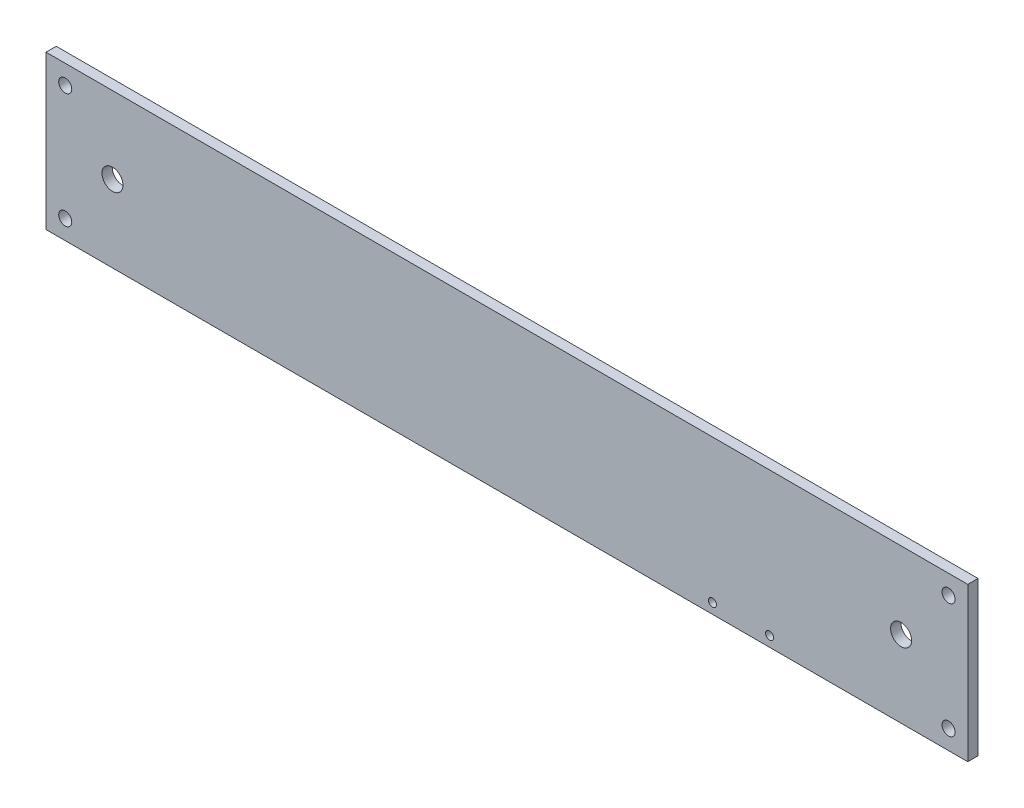
ISO-10303-21;
HEADER;
FILE_DESCRIPTION(('STEP AP214'),'2;1');
FILE_NAME('part.step','',(''),(''),'','','');
FILE_SCHEMA(('AUTOMOTIVE_DESIGN { 1 0 10303 214 1 1 1 1 }'));
ENDSEC;
DATA;
#1=APPLICATION_CONTEXT('core data for automotive mechanical design processes');
#2=APPLICATION_PROTOCOL_DEFINITION('international standard','automotive_design',2000,#1);
#3=PRODUCT_CONTEXT('',#1,'mechanical');
#4=PRODUCT('Part','Part','',(#3));
#5=PRODUCT_RELATED_PRODUCT_CATEGORY('part','',(#4));
#6=PRODUCT_DEFINITION_FORMATION('','',#4);
#7=PRODUCT_DEFINITION_CONTEXT('part definition',#1,'design');
#8=PRODUCT_DEFINITION('design','',#6,#7);
#9=PRODUCT_DEFINITION_SHAPE('','',#8);
#10=(LENGTH_UNIT() NAMED_UNIT(*) SI_UNIT(.MILLI.,.METRE.));
#11=(NAMED_UNIT(*) PLANE_ANGLE_UNIT() SI_UNIT($,.RADIAN.));
#12=(NAMED_UNIT(*) SI_UNIT($,.STERADIAN.) SOLID_ANGLE_UNIT());
#13=UNCERTAINTY_MEASURE_WITH_UNIT(LENGTH_MEASURE(1.E-05),#10,'distance_accuracy_value','');
#14=(GEOMETRIC_REPRESENTATION_CONTEXT(3) GLOBAL_UNCERTAINTY_ASSIGNED_CONTEXT((#13)) GLOBAL_UNIT_ASSIGNED_CONTEXT((#10,
#11,#12)) REPRESENTATION_CONTEXT('',''));
#15=CARTESIAN_POINT('',(0.,0.,0.));
#16=DIRECTION('',(0.,0.,1.));
#17=DIRECTION('',(1.,0.,0.));
#18=AXIS2_PLACEMENT_3D('',#15,#16,#17);
#19=CARTESIAN_POINT('',(0.,0.,4.));
#20=DIRECTION('',(0.,0.,1.));
#21=DIRECTION('',(1.,0.,0.));
#22=AXIS2_PLACEMENT_3D('',#19,#20,#21);
#23=PLANE('',#22);
#24=CARTESIAN_POINT('',(256.65,-25.9999999999998,4.));
#25=DIRECTION('',(0.,0.,1.));
#26=DIRECTION('',(1.,0.,0.));
#27=AXIS2_PLACEMENT_3D('',#24,#25,#26);
#28=CIRCLE('',#27,1.54999999999999);
#29=CARTESIAN_POINT('',(258.2,-25.9999999999998,4.));
#30=VERTEX_POINT('',#29);
#31=EDGE_CURVE('E153',#30,#30,#28,.T.);
#32=ORIENTED_EDGE('',*,*,#31,.F.);
#33=EDGE_LOOP('',(#32));
#34=FACE_BOUND('',#33,.T.);
#35=CARTESIAN_POINT('',(234.35,-25.9999999999998,4.));
#36=DIRECTION('',(0.,0.,1.));
#37=DIRECTION('',(1.,0.,0.));
#38=AXIS2_PLACEMENT_3D('',#35,#36,#37);
#39=CIRCLE('',#38,1.54999999999999);
#40=CARTESIAN_POINT('',(235.9,-25.9999999999998,4.));
#41=VERTEX_POINT('',#40);
#42=EDGE_CURVE('E147',#41,#41,#39,.T.);
#43=ORIENTED_EDGE('',*,*,#42,.F.);
#44=EDGE_LOOP('',(#43));
#45=FACE_BOUND('',#44,.T.);
#46=CARTESIAN_POINT('',(326.533928070041,22.4926529763048,4.));
#47=DIRECTION('',(0.,0.,1.));
#48=DIRECTION('',(1.,0.,0.));
#49=AXIS2_PLACEMENT_3D('',#46,#47,#48);
#50=CIRCLE('',#49,2.55000000000075);
#51=CARTESIAN_POINT('',(329.083928070042,22.4926529763048,4.));
#52=VERTEX_POINT('',#51);
#53=EDGE_CURVE('E132',#52,#52,#50,.T.);
#54=ORIENTED_EDGE('',*,*,#53,.F.);
#55=EDGE_LOOP('',(#54));
#56=FACE_BOUND('',#55,.T.);
#57=CARTESIAN_POINT('',(-18.4513778825719,22.4926529763051,4.));
#58=DIRECTION('',(0.,0.,1.));
#59=DIRECTION('',(1.,0.,0.));
#60=AXIS2_PLACEMENT_3D('',#57,#58,#59);
#61=CIRCLE('',#60,2.55000000000074);
#62=CARTESIAN_POINT('',(-15.9013778825712,22.4926529763051,4.));
#63=VERTEX_POINT('',#62);
#64=EDGE_CURVE('E120',#63,#63,#61,.T.);
#65=ORIENTED_EDGE('',*,*,#64,.F.);
#66=EDGE_LOOP('',(#65));
#67=FACE_BOUND('',#66,.T.);
#68=CARTESIAN_POINT('',(0.,0.,4.));
#69=DIRECTION('',(0.,0.,1.));
#70=DIRECTION('',(1.,0.,0.));
#71=AXIS2_PLACEMENT_3D('',#68,#69,#70);
#72=CIRCLE('',#71,4.09999999999994);
#73=CARTESIAN_POINT('',(4.10000000000002,0.,4.));
#74=VERTEX_POINT('',#73);
#75=EDGE_CURVE('E99',#74,#74,#72,.T.);
#76=ORIENTED_EDGE('',*,*,#75,.F.);
#77=EDGE_LOOP('',(#76));
#78=FACE_BOUND('',#77,.T.);
#79=DIRECTION('',(-1.,0.,0.));
#80=VECTOR('',#79,1.);
#81=CARTESIAN_POINT('',(334.041275093734,29.9999999999983,4.));
#82=LINE('',#81,#80);
#83=CARTESIAN_POINT('',(334.041275093734,29.9999999999983,4.));
#84=VERTEX_POINT('',#83);
#85=CARTESIAN_POINT('',(-25.9587249062654,29.9999999999983,4.));
#86=VERTEX_POINT('',#85);
#87=EDGE_CURVE('E84',#84,#86,#82,.T.);
#88=ORIENTED_EDGE('',*,*,#87,.T.);
#89=DIRECTION('',(0.,-1.,0.));
#90=VECTOR('',#89,1.);
#91=CARTESIAN_POINT('',(-25.9587249062654,29.9999999999983,4.));
#92=LINE('',#91,#90);
#93=CARTESIAN_POINT('',(-25.9587249062655,-30.0000000000017,4.));
#94=VERTEX_POINT('',#93);
#95=EDGE_CURVE('E79',#86,#94,#92,.T.);
#96=ORIENTED_EDGE('',*,*,#95,.T.);
#97=DIRECTION('',(1.,0.,0.));
#98=VECTOR('',#97,1.);
#99=CARTESIAN_POINT('',(-25.9587249062655,-30.0000000000017,4.));
#100=LINE('',#99,#98);
#101=CARTESIAN_POINT('',(334.041275093734,-30.0000000000017,4.));
#102=VERTEX_POINT('',#101);
#103=EDGE_CURVE('E82',#94,#102,#100,.T.);
#104=ORIENTED_EDGE('',*,*,#103,.T.);
#105=DIRECTION('',(0.,1.,0.));
#106=VECTOR('',#105,1.);
#107=CARTESIAN_POINT('',(334.041275093734,-30.0000000000017,4.));
#108=LINE('',#107,#106);
#109=EDGE_CURVE('E49',#102,#84,#108,.T.);
#110=ORIENTED_EDGE('',*,*,#109,.T.);
#111=EDGE_LOOP('',(#88,#96,#104,#110));
#112=FACE_BOUND('',#111,.T.);
#113=CARTESIAN_POINT('',(308.,1.87122327035823E-13,4.));
#114=DIRECTION('',(0.,0.,1.));
#115=DIRECTION('',(1.,0.,0.));
#116=AXIS2_PLACEMENT_3D('',#113,#114,#115);
#117=CIRCLE('',#116,4.09999999999999);
#118=CARTESIAN_POINT('',(312.1,1.87122327035823E-13,4.));
#119=VERTEX_POINT('',#118);
#120=EDGE_CURVE('E114',#119,#119,#117,.T.);
#121=ORIENTED_EDGE('',*,*,#120,.F.);
#122=EDGE_LOOP('',(#121));
#123=FACE_BOUND('',#122,.T.);
#124=CARTESIAN_POINT('',(-18.451377882572,-22.4926529763077,4.));
#125=DIRECTION('',(0.,0.,1.));
#126=DIRECTION('',(1.,0.,0.));
#127=AXIS2_PLACEMENT_3D('',#124,#125,#126);
#128=CIRCLE('',#127,2.55000000000077);
#129=CARTESIAN_POINT('',(-15.9013778825712,-22.4926529763077,4.));
#130=VERTEX_POINT('',#129);
#131=EDGE_CURVE('E126',#130,#130,#128,.T.);
#132=ORIENTED_EDGE('',*,*,#131,.F.);
#133=EDGE_LOOP('',(#132));
#134=FACE_BOUND('',#133,.T.);
#135=CARTESIAN_POINT('',(326.533928070041,-22.4926529763081,4.));
#136=DIRECTION('',(0.,0.,1.));
#137=DIRECTION('',(1.,0.,0.));
#138=AXIS2_PLACEMENT_3D('',#135,#136,#137);
#139=CIRCLE('',#138,2.55000000000075);
#140=CARTESIAN_POINT('',(329.083928070042,-22.4926529763081,4.));
#141=VERTEX_POINT('',#140);
#142=EDGE_CURVE('E138',#141,#141,#139,.T.);
#143=ORIENTED_EDGE('',*,*,#142,.F.);
#144=EDGE_LOOP('',(#143));
#145=FACE_BOUND('',#144,.T.);
#146=ADVANCED_FACE('F32',(#34,#45,#56,#67,#78,#112,#123,#134,#145),#23,.T.);
#147=CARTESIAN_POINT('',(0.,0.,0.));
#148=DIRECTION('',(0.,0.,1.));
#149=DIRECTION('',(1.,0.,0.));
#150=AXIS2_PLACEMENT_3D('',#147,#148,#149);
#151=PLANE('',#150);
#152=CARTESIAN_POINT('',(256.65,-25.9999999999998,0.));
#153=DIRECTION('',(0.,0.,1.));
#154=DIRECTION('',(1.,0.,0.));
#155=AXIS2_PLACEMENT_3D('',#152,#153,#154);
#156=CIRCLE('',#155,1.54999999999999);
#157=CARTESIAN_POINT('',(258.2,-25.9999999999998,0.));
#158=VERTEX_POINT('',#157);
#159=EDGE_CURVE('E144',#158,#158,#156,.T.);
#160=ORIENTED_EDGE('',*,*,#159,.T.);
#161=EDGE_LOOP('',(#160));
#162=FACE_BOUND('',#161,.T.);
#163=CARTESIAN_POINT('',(234.35,-25.9999999999998,0.));
#164=DIRECTION('',(0.,0.,1.));
#165=DIRECTION('',(1.,0.,0.));
#166=AXIS2_PLACEMENT_3D('',#163,#164,#165);
#167=CIRCLE('',#166,1.54999999999999);
#168=CARTESIAN_POINT('',(235.9,-25.9999999999998,0.));
#169=VERTEX_POINT('',#168);
#170=EDGE_CURVE('E150',#169,#169,#167,.T.);
#171=ORIENTED_EDGE('',*,*,#170,.T.);
#172=EDGE_LOOP('',(#171));
#173=FACE_BOUND('',#172,.T.);
#174=DIRECTION('',(-1.,0.,0.));
#175=VECTOR('',#174,1.);
#176=CARTESIAN_POINT('',(334.041275093734,29.9999999999983,0.));
#177=LINE('',#176,#175);
#178=CARTESIAN_POINT('',(334.041275093734,29.9999999999983,0.));
#179=VERTEX_POINT('',#178);
#180=CARTESIAN_POINT('',(-25.9587249062654,29.9999999999983,0.));
#181=VERTEX_POINT('',#180);
#182=EDGE_CURVE('E96',#179,#181,#177,.T.);
#183=ORIENTED_EDGE('',*,*,#182,.F.);
#184=DIRECTION('',(0.,1.,0.));
#185=VECTOR('',#184,1.);
#186=CARTESIAN_POINT('',(334.041275093734,-30.0000000000017,0.));
#187=LINE('',#186,#185);
#188=CARTESIAN_POINT('',(334.041275093734,-30.0000000000017,0.));
#189=VERTEX_POINT('',#188);
#190=EDGE_CURVE('E72',#189,#179,#187,.T.);
#191=ORIENTED_EDGE('',*,*,#190,.F.);
#192=DIRECTION('',(1.,0.,0.));
#193=VECTOR('',#192,1.);
#194=CARTESIAN_POINT('',(-25.9587249062655,-30.0000000000017,0.));
#195=LINE('',#194,#193);
#196=CARTESIAN_POINT('',(-25.9587249062655,-30.0000000000017,0.));
#197=VERTEX_POINT('',#196);
#198=EDGE_CURVE('E66',#197,#189,#195,.T.);
#199=ORIENTED_EDGE('',*,*,#198,.F.);
#200=DIRECTION('',(0.,-1.,0.));
#201=VECTOR('',#200,1.);
#202=CARTESIAN_POINT('',(-25.9587249062654,29.9999999999983,0.));
#203=LINE('',#202,#201);
#204=EDGE_CURVE('E88',#181,#197,#203,.T.);
#205=ORIENTED_EDGE('',*,*,#204,.F.);
#206=EDGE_LOOP('',(#183,#191,#199,#205));
#207=FACE_BOUND('',#206,.T.);
#208=CARTESIAN_POINT('',(0.,0.,0.));
#209=DIRECTION('',(0.,0.,1.));
#210=DIRECTION('',(1.,0.,0.));
#211=AXIS2_PLACEMENT_3D('',#208,#209,#210);
#212=CIRCLE('',#211,4.09999999999994);
#213=CARTESIAN_POINT('',(4.10000000000002,0.,0.));
#214=VERTEX_POINT('',#213);
#215=EDGE_CURVE('E111',#214,#214,#212,.T.);
#216=ORIENTED_EDGE('',*,*,#215,.T.);
#217=EDGE_LOOP('',(#216));
#218=FACE_BOUND('',#217,.T.);
#219=CARTESIAN_POINT('',(308.,1.87122327035823E-13,0.));
#220=DIRECTION('',(0.,0.,1.));
#221=DIRECTION('',(1.,0.,0.));
#222=AXIS2_PLACEMENT_3D('',#219,#220,#221);
#223=CIRCLE('',#222,4.09999999999999);
#224=CARTESIAN_POINT('',(312.1,1.87122327035823E-13,0.));
#225=VERTEX_POINT('',#224);
#226=EDGE_CURVE('E117',#225,#225,#223,.T.);
#227=ORIENTED_EDGE('',*,*,#226,.T.);
#228=EDGE_LOOP('',(#227));
#229=FACE_BOUND('',#228,.T.);
#230=CARTESIAN_POINT('',(-18.4513778825719,22.4926529763051,0.));
#231=DIRECTION('',(0.,0.,1.));
#232=DIRECTION('',(1.,0.,0.));
#233=AXIS2_PLACEMENT_3D('',#230,#231,#232);
#234=CIRCLE('',#233,2.55000000000074);
#235=CARTESIAN_POINT('',(-15.9013778825712,22.4926529763051,0.));
#236=VERTEX_POINT('',#235);
#237=EDGE_CURVE('E123',#236,#236,#234,.T.);
#238=ORIENTED_EDGE('',*,*,#237,.T.);
#239=EDGE_LOOP('',(#238));
#240=FACE_BOUND('',#239,.T.);
#241=CARTESIAN_POINT('',(-18.451377882572,-22.4926529763077,0.));
#242=DIRECTION('',(0.,0.,1.));
#243=DIRECTION('',(1.,0.,0.));
#244=AXIS2_PLACEMENT_3D('',#241,#242,#243);
#245=CIRCLE('',#244,2.55000000000077);
#246=CARTESIAN_POINT('',(-15.9013778825712,-22.4926529763077,0.));
#247=VERTEX_POINT('',#246);
#248=EDGE_CURVE('E129',#247,#247,#245,.T.);
#249=ORIENTED_EDGE('',*,*,#248,.T.);
#250=EDGE_LOOP('',(#249));
#251=FACE_BOUND('',#250,.T.);
#252=CARTESIAN_POINT('',(326.533928070041,22.4926529763048,0.));
#253=DIRECTION('',(0.,0.,1.));
#254=DIRECTION('',(1.,0.,0.));
#255=AXIS2_PLACEMENT_3D('',#252,#253,#254);
#256=CIRCLE('',#255,2.55000000000075);
#257=CARTESIAN_POINT('',(329.083928070042,22.4926529763048,0.));
#258=VERTEX_POINT('',#257);
#259=EDGE_CURVE('E135',#258,#258,#256,.T.);
#260=ORIENTED_EDGE('',*,*,#259,.T.);
#261=EDGE_LOOP('',(#260));
#262=FACE_BOUND('',#261,.T.);
#263=CARTESIAN_POINT('',(326.533928070041,-22.4926529763081,0.));
#264=DIRECTION('',(0.,0.,1.));
#265=DIRECTION('',(1.,0.,0.));
#266=AXIS2_PLACEMENT_3D('',#263,#264,#265);
#267=CIRCLE('',#266,2.55000000000075);
#268=CARTESIAN_POINT('',(329.083928070042,-22.4926529763081,0.));
#269=VERTEX_POINT('',#268);
#270=EDGE_CURVE('E141',#269,#269,#267,.T.);
#271=ORIENTED_EDGE('',*,*,#270,.T.);
#272=EDGE_LOOP('',(#271));
#273=FACE_BOUND('',#272,.T.);
#274=ADVANCED_FACE('F107',(#162,#173,#207,#218,#229,#240,#251,#262,#273),#151,.F.);
#275=CARTESIAN_POINT('',(334.041275093734,29.9999999999983,4.));
#276=DIRECTION('',(0.,-1.,0.));
#277=DIRECTION('',(1.,0.,0.));
#278=AXIS2_PLACEMENT_3D('',#275,#276,#277);
#279=PLANE('',#278);
#280=ORIENTED_EDGE('',*,*,#182,.T.);
#281=DIRECTION('',(0.,0.,-1.));
#282=VECTOR('',#281,1.);
#283=CARTESIAN_POINT('',(-25.9587249062654,29.9999999999983,4.));
#284=LINE('',#283,#282);
#285=EDGE_CURVE('E11',#86,#181,#284,.T.);
#286=ORIENTED_EDGE('',*,*,#285,.F.);
#287=ORIENTED_EDGE('',*,*,#87,.F.);
#288=DIRECTION('',(0.,0.,-1.));
#289=VECTOR('',#288,1.);
#290=CARTESIAN_POINT('',(334.041275093734,29.9999999999983,4.));
#291=LINE('',#290,#289);
#292=EDGE_CURVE('E92',#84,#179,#291,.T.);
#293=ORIENTED_EDGE('',*,*,#292,.T.);
#294=EDGE_LOOP('',(#280,#286,#287,#293));
#295=FACE_BOUND('',#294,.T.);
#296=ADVANCED_FACE('F34',(#295),#279,.F.);
#297=CARTESIAN_POINT('',(-25.9587249062654,29.9999999999983,4.));
#298=DIRECTION('',(1.,0.,0.));
#299=DIRECTION('',(0.,1.,0.));
#300=AXIS2_PLACEMENT_3D('',#297,#298,#299);
#301=PLANE('',#300);
#302=ORIENTED_EDGE('',*,*,#204,.T.);
#303=DIRECTION('',(0.,0.,-1.));
#304=VECTOR('',#303,1.);
#305=CARTESIAN_POINT('',(-25.9587249062655,-30.0000000000017,4.));
#306=LINE('',#305,#304);
#307=EDGE_CURVE('E41',#94,#197,#306,.T.);
#308=ORIENTED_EDGE('',*,*,#307,.F.);
#309=ORIENTED_EDGE('',*,*,#95,.F.);
#310=ORIENTED_EDGE('',*,*,#285,.T.);
#311=EDGE_LOOP('',(#302,#308,#309,#310));
#312=FACE_BOUND('',#311,.T.);
#313=ADVANCED_FACE('F87',(#312),#301,.F.);
#314=CARTESIAN_POINT('',(-25.9587249062655,-30.0000000000017,4.));
#315=DIRECTION('',(0.,1.,0.));
#316=DIRECTION('',(-1.,0.,0.));
#317=AXIS2_PLACEMENT_3D('',#314,#315,#316);
#318=PLANE('',#317);
#319=ORIENTED_EDGE('',*,*,#198,.T.);
#320=DIRECTION('',(0.,0.,-1.));
#321=VECTOR('',#320,1.);
#322=CARTESIAN_POINT('',(334.041275093734,-30.0000000000017,4.));
#323=LINE('',#322,#321);
#324=EDGE_CURVE('E89',#102,#189,#323,.T.);
#325=ORIENTED_EDGE('',*,*,#324,.F.);
#326=ORIENTED_EDGE('',*,*,#103,.F.);
#327=ORIENTED_EDGE('',*,*,#307,.T.);
#328=EDGE_LOOP('',(#319,#325,#326,#327));
#329=FACE_BOUND('',#328,.T.);
#330=ADVANCED_FACE('F90',(#329),#318,.F.);
#331=CARTESIAN_POINT('',(334.041275093734,-30.0000000000017,4.));
#332=DIRECTION('',(-1.,0.,0.));
#333=DIRECTION('',(0.,0.,1.));
#334=AXIS2_PLACEMENT_3D('',#331,#332,#333);
#335=PLANE('',#334);
#336=ORIENTED_EDGE('',*,*,#190,.T.);
#337=ORIENTED_EDGE('',*,*,#292,.F.);
#338=ORIENTED_EDGE('',*,*,#109,.F.);
#339=ORIENTED_EDGE('',*,*,#324,.T.);
#340=EDGE_LOOP('',(#336,#337,#338,#339));
#341=FACE_BOUND('',#340,.T.);
#342=ADVANCED_FACE('F104',(#341),#335,.F.);
#343=CARTESIAN_POINT('',(0.,0.,4.));
#344=DIRECTION('',(0.,0.,-1.));
#345=DIRECTION('',(-1.,0.,0.));
#346=AXIS2_PLACEMENT_3D('',#343,#344,#345);
#347=CYLINDRICAL_SURFACE('',#346,4.09999999999994);
#348=ORIENTED_EDGE('',*,*,#75,.T.);
#349=EDGE_LOOP('',(#348));
#350=FACE_BOUND('',#349,.T.);
#351=ORIENTED_EDGE('',*,*,#215,.F.);
#352=EDGE_LOOP('',(#351));
#353=FACE_BOUND('',#352,.T.);
#354=ADVANCED_FACE('F179',(#350,#353),#347,.F.);
#355=CARTESIAN_POINT('',(308.,1.87122327035823E-13,4.));
#356=DIRECTION('',(0.,0.,-1.));
#357=DIRECTION('',(-1.,0.,0.));
#358=AXIS2_PLACEMENT_3D('',#355,#356,#357);
#359=CYLINDRICAL_SURFACE('',#358,4.09999999999999);
#360=ORIENTED_EDGE('',*,*,#120,.T.);
#361=EDGE_LOOP('',(#360));
#362=FACE_BOUND('',#361,.T.);
#363=ORIENTED_EDGE('',*,*,#226,.F.);
#364=EDGE_LOOP('',(#363));
#365=FACE_BOUND('',#364,.T.);
#366=ADVANCED_FACE('F182',(#362,#365),#359,.F.);
#367=CARTESIAN_POINT('',(-18.4513778825719,22.4926529763051,4.));
#368=DIRECTION('',(0.,0.,-1.));
#369=DIRECTION('',(-1.,0.,0.));
#370=AXIS2_PLACEMENT_3D('',#367,#368,#369);
#371=CYLINDRICAL_SURFACE('',#370,2.55000000000074);
#372=ORIENTED_EDGE('',*,*,#64,.T.);
#373=EDGE_LOOP('',(#372));
#374=FACE_BOUND('',#373,.T.);
#375=ORIENTED_EDGE('',*,*,#237,.F.);
#376=EDGE_LOOP('',(#375));
#377=FACE_BOUND('',#376,.T.);
#378=ADVANCED_FACE('F215',(#374,#377),#371,.F.);
#379=CARTESIAN_POINT('',(-18.451377882572,-22.4926529763077,4.));
#380=DIRECTION('',(0.,0.,-1.));
#381=DIRECTION('',(-1.,0.,0.));
#382=AXIS2_PLACEMENT_3D('',#379,#380,#381);
#383=CYLINDRICAL_SURFACE('',#382,2.55000000000077);
#384=ORIENTED_EDGE('',*,*,#131,.T.);
#385=EDGE_LOOP('',(#384));
#386=FACE_BOUND('',#385,.T.);
#387=ORIENTED_EDGE('',*,*,#248,.F.);
#388=EDGE_LOOP('',(#387));
#389=FACE_BOUND('',#388,.T.);
#390=ADVANCED_FACE('F209',(#386,#389),#383,.F.);
#391=CARTESIAN_POINT('',(326.533928070041,22.4926529763048,4.));
#392=DIRECTION('',(0.,0.,-1.));
#393=DIRECTION('',(-1.,0.,0.));
#394=AXIS2_PLACEMENT_3D('',#391,#392,#393);
#395=CYLINDRICAL_SURFACE('',#394,2.55000000000075);
#396=ORIENTED_EDGE('',*,*,#53,.T.);
#397=EDGE_LOOP('',(#396));
#398=FACE_BOUND('',#397,.T.);
#399=ORIENTED_EDGE('',*,*,#259,.F.);
#400=EDGE_LOOP('',(#399));
#401=FACE_BOUND('',#400,.T.);
#402=ADVANCED_FACE('F200',(#398,#401),#395,.F.);
#403=CARTESIAN_POINT('',(326.533928070041,-22.4926529763081,4.));
#404=DIRECTION('',(0.,0.,-1.));
#405=DIRECTION('',(-1.,0.,0.));
#406=AXIS2_PLACEMENT_3D('',#403,#404,#405);
#407=CYLINDRICAL_SURFACE('',#406,2.55000000000075);
#408=ORIENTED_EDGE('',*,*,#142,.T.);
#409=EDGE_LOOP('',(#408));
#410=FACE_BOUND('',#409,.T.);
#411=ORIENTED_EDGE('',*,*,#270,.F.);
#412=EDGE_LOOP('',(#411));
#413=FACE_BOUND('',#412,.T.);
#414=ADVANCED_FACE('F198',(#410,#413),#407,.F.);
#415=CARTESIAN_POINT('',(234.35,-25.9999999999998,0.));
#416=DIRECTION('',(0.,0.,1.));
#417=DIRECTION('',(1.,0.,0.));
#418=AXIS2_PLACEMENT_3D('',#415,#416,#417);
#419=CYLINDRICAL_SURFACE('',#418,1.54999999999999);
#420=ORIENTED_EDGE('',*,*,#170,.F.);
#421=EDGE_LOOP('',(#420));
#422=FACE_BOUND('',#421,.T.);
#423=ORIENTED_EDGE('',*,*,#42,.T.);
#424=EDGE_LOOP('',(#423));
#425=FACE_BOUND('',#424,.T.);
#426=ADVANCED_FACE('F164',(#422,#425),#419,.F.);
#427=CARTESIAN_POINT('',(256.65,-25.9999999999998,0.));
#428=DIRECTION('',(0.,0.,1.));
#429=DIRECTION('',(1.,0.,0.));
#430=AXIS2_PLACEMENT_3D('',#427,#428,#429);
#431=CYLINDRICAL_SURFACE('',#430,1.54999999999999);
#432=ORIENTED_EDGE('',*,*,#159,.F.);
#433=EDGE_LOOP('',(#432));
#434=FACE_BOUND('',#433,.T.);
#435=ORIENTED_EDGE('',*,*,#31,.T.);
#436=EDGE_LOOP('',(#435));
#437=FACE_BOUND('',#436,.T.);
#438=ADVANCED_FACE('F161',(#434,#437),#431,.F.);
#439=CLOSED_SHELL('',(#146,#274,#296,#313,#330,#342,#354,#366,#378,#390,#402,#414,#426,#438));
#440=MANIFOLD_SOLID_BREP('B2',#439);
#441=ADVANCED_BREP_SHAPE_REPRESENTATION('',(#18,#440),#14);
#442=SHAPE_DEFINITION_REPRESENTATION(#9,#441);
ENDSEC;
END-ISO-10303-21;
